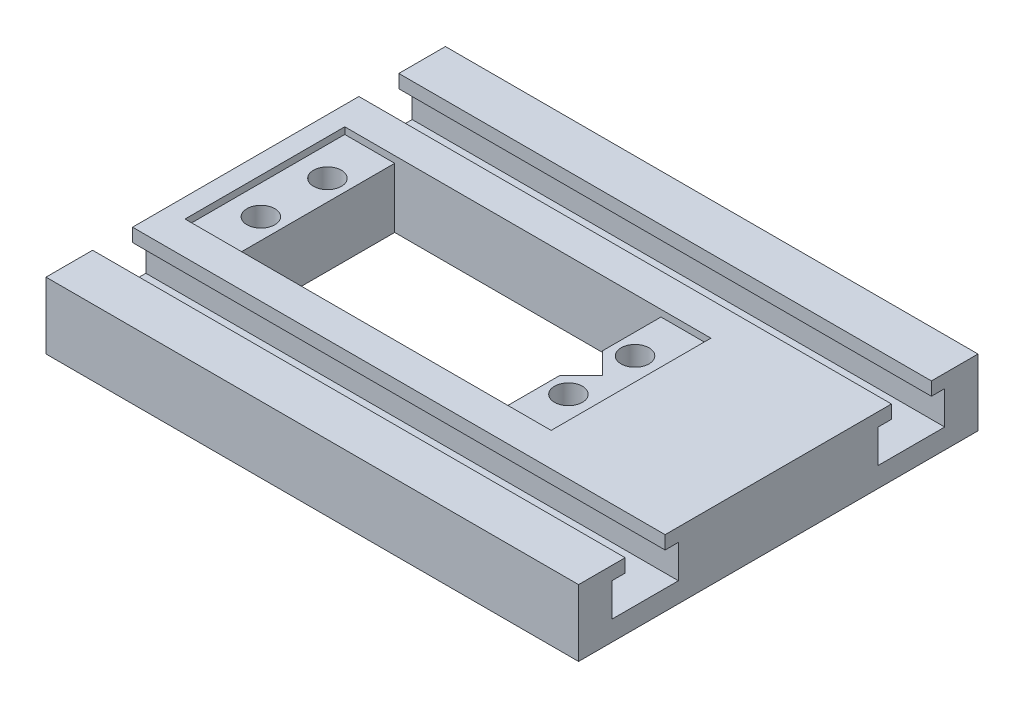
ISO-10303-21;
HEADER;
FILE_DESCRIPTION(('STEP AP214'),'2;1');
FILE_NAME('part.step','',(''),(''),'','','');
FILE_SCHEMA(('AUTOMOTIVE_DESIGN { 1 0 10303 214 1 1 1 1 }'));
ENDSEC;
DATA;
#1=APPLICATION_CONTEXT('core data for automotive mechanical design processes');
#2=APPLICATION_PROTOCOL_DEFINITION('international standard','automotive_design',2000,#1);
#3=PRODUCT_CONTEXT('',#1,'mechanical');
#4=PRODUCT('Part','Part','',(#3));
#5=PRODUCT_RELATED_PRODUCT_CATEGORY('part','',(#4));
#6=PRODUCT_DEFINITION_FORMATION('','',#4);
#7=PRODUCT_DEFINITION_CONTEXT('part definition',#1,'design');
#8=PRODUCT_DEFINITION('design','',#6,#7);
#9=PRODUCT_DEFINITION_SHAPE('','',#8);
#10=(LENGTH_UNIT() NAMED_UNIT(*) SI_UNIT(.MILLI.,.METRE.));
#11=(NAMED_UNIT(*) PLANE_ANGLE_UNIT() SI_UNIT($,.RADIAN.));
#12=(NAMED_UNIT(*) SI_UNIT($,.STERADIAN.) SOLID_ANGLE_UNIT());
#13=UNCERTAINTY_MEASURE_WITH_UNIT(LENGTH_MEASURE(1.E-05),#10,'distance_accuracy_value','');
#14=(GEOMETRIC_REPRESENTATION_CONTEXT(3) GLOBAL_UNCERTAINTY_ASSIGNED_CONTEXT((#13)) GLOBAL_UNIT_ASSIGNED_CONTEXT((#10,
#11,#12)) REPRESENTATION_CONTEXT('',''));
#15=CARTESIAN_POINT('',(0.,0.,0.));
#16=DIRECTION('',(0.,0.,1.));
#17=DIRECTION('',(1.,0.,0.));
#18=AXIS2_PLACEMENT_3D('',#15,#16,#17);
#19=CARTESIAN_POINT('',(10.38,10.,0.));
#20=DIRECTION('',(1.,0.,0.));
#21=DIRECTION('',(0.,0.,-1.));
#22=AXIS2_PLACEMENT_3D('',#19,#20,#21);
#23=PLANE('',#22);
#24=DIRECTION('',(0.,0.,1.));
#25=VECTOR('',#24,1.);
#26=CARTESIAN_POINT('',(10.38,9.,0.));
#27=LINE('',#26,#25);
#28=CARTESIAN_POINT('',(10.38,9.,-12.));
#29=VERTEX_POINT('',#28);
#30=CARTESIAN_POINT('',(10.38,9.00000000000001,-3.25000000000005));
#31=VERTEX_POINT('',#30);
#32=EDGE_CURVE('E299',#29,#31,#27,.T.);
#33=ORIENTED_EDGE('',*,*,#32,.F.);
#34=DIRECTION('',(0.,-1.,0.));
#35=VECTOR('',#34,1.);
#36=CARTESIAN_POINT('',(10.38,10.,-12.));
#37=LINE('',#36,#35);
#38=CARTESIAN_POINT('',(10.38,0.,-12.));
#39=VERTEX_POINT('',#38);
#40=EDGE_CURVE('E578',#29,#39,#37,.T.);
#41=ORIENTED_EDGE('',*,*,#40,.T.);
#42=DIRECTION('',(0.,0.,1.));
#43=VECTOR('',#42,1.);
#44=CARTESIAN_POINT('',(10.38,0.,0.));
#45=LINE('',#44,#43);
#46=CARTESIAN_POINT('',(10.38,0.,-3.25000000000005));
#47=VERTEX_POINT('',#46);
#48=EDGE_CURVE('E557',#39,#47,#45,.T.);
#49=ORIENTED_EDGE('',*,*,#48,.T.);
#50=DIRECTION('',(0.,1.,0.));
#51=VECTOR('',#50,1.);
#52=CARTESIAN_POINT('',(10.38,-70.,-3.25000000000005));
#53=LINE('',#52,#51);
#54=EDGE_CURVE('E322',#47,#31,#53,.T.);
#55=ORIENTED_EDGE('',*,*,#54,.T.);
#56=EDGE_LOOP('',(#33,#41,#49,#55));
#57=FACE_BOUND('',#56,.T.);
#58=ADVANCED_FACE('F41',(#57),#23,.F.);
#59=CARTESIAN_POINT('',(0.,10.,0.));
#60=DIRECTION('',(0.,1.,0.));
#61=DIRECTION('',(0.,0.,1.));
#62=AXIS2_PLACEMENT_3D('',#59,#60,#61);
#63=PLANE('',#62);
#64=DIRECTION('',(1.,0.,0.));
#65=VECTOR('',#64,1.);
#66=CARTESIAN_POINT('',(-40.,10.,17.));
#67=LINE('',#66,#65);
#68=CARTESIAN_POINT('',(-40.,10.,17.));
#69=VERTEX_POINT('',#68);
#70=CARTESIAN_POINT('',(40.,10.,17.));
#71=VERTEX_POINT('',#70);
#72=EDGE_CURVE('E391',#69,#71,#67,.T.);
#73=ORIENTED_EDGE('',*,*,#72,.T.);
#74=DIRECTION('',(0.,0.,1.));
#75=VECTOR('',#74,1.);
#76=CARTESIAN_POINT('',(40.,10.,0.));
#77=LINE('',#76,#75);
#78=CARTESIAN_POINT('',(40.,10.,-17.));
#79=VERTEX_POINT('',#78);
#80=EDGE_CURVE('E499',#79,#71,#77,.T.);
#81=ORIENTED_EDGE('',*,*,#80,.F.);
#82=DIRECTION('',(1.,0.,0.));
#83=VECTOR('',#82,1.);
#84=CARTESIAN_POINT('',(-40.,10.,-17.));
#85=LINE('',#84,#83);
#86=CARTESIAN_POINT('',(-40.,10.,-17.));
#87=VERTEX_POINT('',#86);
#88=EDGE_CURVE('E445',#87,#79,#85,.T.);
#89=ORIENTED_EDGE('',*,*,#88,.F.);
#90=DIRECTION('',(0.,0.,1.));
#91=VECTOR('',#90,1.);
#92=CARTESIAN_POINT('',(-40.,10.,0.));
#93=LINE('',#92,#91);
#94=EDGE_CURVE('E510',#87,#69,#93,.T.);
#95=ORIENTED_EDGE('',*,*,#94,.T.);
#96=EDGE_LOOP('',(#73,#81,#89,#95));
#97=FACE_BOUND('',#96,.T.);
#98=DIRECTION('',(0.,0.,1.));
#99=VECTOR('',#98,1.);
#100=CARTESIAN_POINT('',(-37.12,10.,-12.));
#101=LINE('',#100,#99);
#102=CARTESIAN_POINT('',(-37.12,10.,-12.));
#103=VERTEX_POINT('',#102);
#104=CARTESIAN_POINT('',(-37.12,10.,12.));
#105=VERTEX_POINT('',#104);
#106=EDGE_CURVE('E251',#103,#105,#101,.T.);
#107=ORIENTED_EDGE('',*,*,#106,.F.);
#108=DIRECTION('',(1.,0.,0.));
#109=VECTOR('',#108,1.);
#110=CARTESIAN_POINT('',(0.,10.,-12.));
#111=LINE('',#110,#109);
#112=CARTESIAN_POINT('',(17.88,10.,-12.));
#113=VERTEX_POINT('',#112);
#114=EDGE_CURVE('E514',#103,#113,#111,.T.);
#115=ORIENTED_EDGE('',*,*,#114,.T.);
#116=DIRECTION('',(0.,0.,1.));
#117=VECTOR('',#116,1.);
#118=CARTESIAN_POINT('',(17.88,10.,-12.));
#119=LINE('',#118,#117);
#120=CARTESIAN_POINT('',(17.88,10.,12.));
#121=VERTEX_POINT('',#120);
#122=EDGE_CURVE('E269',#113,#121,#119,.T.);
#123=ORIENTED_EDGE('',*,*,#122,.T.);
#124=DIRECTION('',(1.,0.,0.));
#125=VECTOR('',#124,1.);
#126=CARTESIAN_POINT('',(0.,10.,12.));
#127=LINE('',#126,#125);
#128=EDGE_CURVE('E517',#105,#121,#127,.T.);
#129=ORIENTED_EDGE('',*,*,#128,.F.);
#130=EDGE_LOOP('',(#107,#115,#123,#129));
#131=FACE_BOUND('',#130,.T.);
#132=ADVANCED_FACE('F630',(#97,#131),#63,.T.);
#133=DIRECTION('',(0.,0.,1.));
#134=VECTOR('',#133,1.);
#135=CARTESIAN_POINT('',(10.38,9.,0.));
#136=LINE('',#135,#134);
#137=CARTESIAN_POINT('',(10.38,9.00000000000001,3.24999999999995));
#138=VERTEX_POINT('',#137);
#139=CARTESIAN_POINT('',(10.38,9.,12.));
#140=VERTEX_POINT('',#139);
#141=EDGE_CURVE('E296',#138,#140,#136,.T.);
#142=ORIENTED_EDGE('',*,*,#141,.F.);
#143=DIRECTION('',(0.,1.,0.));
#144=VECTOR('',#143,1.);
#145=CARTESIAN_POINT('',(10.38,-70.,3.24999999999995));
#146=LINE('',#145,#144);
#147=CARTESIAN_POINT('',(10.38,0.,3.24999999999995));
#148=VERTEX_POINT('',#147);
#149=EDGE_CURVE('E321',#148,#138,#146,.T.);
#150=ORIENTED_EDGE('',*,*,#149,.F.);
#151=CARTESIAN_POINT('',(10.38,0.,12.));
#152=VERTEX_POINT('',#151);
#153=EDGE_CURVE('E556',#148,#152,#45,.T.);
#154=ORIENTED_EDGE('',*,*,#153,.T.);
#155=DIRECTION('',(0.,-1.,0.));
#156=VECTOR('',#155,1.);
#157=CARTESIAN_POINT('',(10.38,10.,12.));
#158=LINE('',#157,#156);
#159=EDGE_CURVE('E575',#140,#152,#158,.T.);
#160=ORIENTED_EDGE('',*,*,#159,.F.);
#161=EDGE_LOOP('',(#142,#150,#154,#160));
#162=FACE_BOUND('',#161,.T.);
#163=ADVANCED_FACE('F722',(#162),#23,.F.);
#164=CARTESIAN_POINT('',(13.48,10.,-5.));
#165=DIRECTION('',(0.,-1.,0.));
#166=DIRECTION('',(0.,0.,-1.));
#167=AXIS2_PLACEMENT_3D('',#164,#165,#166);
#168=CYLINDRICAL_SURFACE('',#167,2.1);
#169=CARTESIAN_POINT('',(13.48,0.,-5.));
#170=DIRECTION('',(0.,1.,0.));
#171=DIRECTION('',(0.,0.,1.));
#172=AXIS2_PLACEMENT_3D('',#169,#170,#171);
#173=CIRCLE('',#172,2.1);
#174=CARTESIAN_POINT('',(13.48,0.,-2.9));
#175=VERTEX_POINT('',#174);
#176=EDGE_CURVE('E532',#175,#175,#173,.T.);
#177=ORIENTED_EDGE('',*,*,#176,.F.);
#178=EDGE_LOOP('',(#177));
#179=FACE_BOUND('',#178,.T.);
#180=CARTESIAN_POINT('',(13.48,9.,-5.));
#181=DIRECTION('',(0.,1.,0.));
#182=DIRECTION('',(0.,0.,1.));
#183=AXIS2_PLACEMENT_3D('',#180,#181,#182);
#184=CIRCLE('',#183,2.1);
#185=CARTESIAN_POINT('',(13.48,9.,-2.9));
#186=VERTEX_POINT('',#185);
#187=EDGE_CURVE('E317',#186,#186,#184,.T.);
#188=ORIENTED_EDGE('',*,*,#187,.T.);
#189=EDGE_LOOP('',(#188));
#190=FACE_BOUND('',#189,.T.);
#191=ADVANCED_FACE('F730',(#179,#190),#168,.F.);
#192=CARTESIAN_POINT('',(13.48,10.,5.));
#193=DIRECTION('',(0.,-1.,0.));
#194=DIRECTION('',(0.,0.,-1.));
#195=AXIS2_PLACEMENT_3D('',#192,#193,#194);
#196=CYLINDRICAL_SURFACE('',#195,2.1);
#197=CARTESIAN_POINT('',(13.48,0.,5.));
#198=DIRECTION('',(0.,1.,0.));
#199=DIRECTION('',(0.,0.,1.));
#200=AXIS2_PLACEMENT_3D('',#197,#198,#199);
#201=CIRCLE('',#200,2.1);
#202=CARTESIAN_POINT('',(13.48,0.,7.1));
#203=VERTEX_POINT('',#202);
#204=EDGE_CURVE('E528',#203,#203,#201,.T.);
#205=ORIENTED_EDGE('',*,*,#204,.F.);
#206=EDGE_LOOP('',(#205));
#207=FACE_BOUND('',#206,.T.);
#208=CARTESIAN_POINT('',(13.48,9.,5.));
#209=DIRECTION('',(0.,1.,0.));
#210=DIRECTION('',(0.,0.,1.));
#211=AXIS2_PLACEMENT_3D('',#208,#209,#210);
#212=CIRCLE('',#211,2.1);
#213=CARTESIAN_POINT('',(13.48,9.,7.1));
#214=VERTEX_POINT('',#213);
#215=EDGE_CURVE('E313',#214,#214,#212,.T.);
#216=ORIENTED_EDGE('',*,*,#215,.T.);
#217=EDGE_LOOP('',(#216));
#218=FACE_BOUND('',#217,.T.);
#219=ADVANCED_FACE('F734',(#207,#218),#196,.F.);
#220=CARTESIAN_POINT('',(-32.72,10.,-5.));
#221=DIRECTION('',(0.,-1.,0.));
#222=DIRECTION('',(0.,0.,-1.));
#223=AXIS2_PLACEMENT_3D('',#220,#221,#222);
#224=CYLINDRICAL_SURFACE('',#223,2.1);
#225=CARTESIAN_POINT('',(-32.72,0.,-5.));
#226=DIRECTION('',(0.,1.,0.));
#227=DIRECTION('',(0.,0.,1.));
#228=AXIS2_PLACEMENT_3D('',#225,#226,#227);
#229=CIRCLE('',#228,2.1);
#230=CARTESIAN_POINT('',(-32.72,0.,-2.9));
#231=VERTEX_POINT('',#230);
#232=EDGE_CURVE('E524',#231,#231,#229,.T.);
#233=ORIENTED_EDGE('',*,*,#232,.F.);
#234=EDGE_LOOP('',(#233));
#235=FACE_BOUND('',#234,.T.);
#236=CARTESIAN_POINT('',(-32.72,9.,-5.));
#237=DIRECTION('',(0.,1.,0.));
#238=DIRECTION('',(0.,0.,1.));
#239=AXIS2_PLACEMENT_3D('',#236,#237,#238);
#240=CIRCLE('',#239,2.1);
#241=CARTESIAN_POINT('',(-32.72,9.,-2.9));
#242=VERTEX_POINT('',#241);
#243=EDGE_CURVE('E309',#242,#242,#240,.T.);
#244=ORIENTED_EDGE('',*,*,#243,.T.);
#245=EDGE_LOOP('',(#244));
#246=FACE_BOUND('',#245,.T.);
#247=ADVANCED_FACE('F777',(#235,#246),#224,.F.);
#248=CARTESIAN_POINT('',(-32.72,10.,5.));
#249=DIRECTION('',(0.,-1.,0.));
#250=DIRECTION('',(0.,0.,-1.));
#251=AXIS2_PLACEMENT_3D('',#248,#249,#250);
#252=CYLINDRICAL_SURFACE('',#251,2.1);
#253=CARTESIAN_POINT('',(-32.72,0.,5.));
#254=DIRECTION('',(0.,1.,0.));
#255=DIRECTION('',(0.,0.,1.));
#256=AXIS2_PLACEMENT_3D('',#253,#254,#255);
#257=CIRCLE('',#256,2.1);
#258=CARTESIAN_POINT('',(-32.72,0.,7.1));
#259=VERTEX_POINT('',#258);
#260=EDGE_CURVE('E395',#259,#259,#257,.T.);
#261=ORIENTED_EDGE('',*,*,#260,.F.);
#262=EDGE_LOOP('',(#261));
#263=FACE_BOUND('',#262,.T.);
#264=CARTESIAN_POINT('',(-32.72,9.,5.));
#265=DIRECTION('',(0.,1.,0.));
#266=DIRECTION('',(0.,0.,1.));
#267=AXIS2_PLACEMENT_3D('',#264,#265,#266);
#268=CIRCLE('',#267,2.1);
#269=CARTESIAN_POINT('',(-32.72,9.,7.1));
#270=VERTEX_POINT('',#269);
#271=EDGE_CURVE('E305',#270,#270,#268,.T.);
#272=ORIENTED_EDGE('',*,*,#271,.T.);
#273=EDGE_LOOP('',(#272));
#274=FACE_BOUND('',#273,.T.);
#275=ADVANCED_FACE('F43',(#263,#274),#252,.F.);
#276=CARTESIAN_POINT('',(-29.62,10.,0.));
#277=DIRECTION('',(1.,0.,0.));
#278=DIRECTION('',(0.,0.,-1.));
#279=AXIS2_PLACEMENT_3D('',#276,#277,#278);
#280=PLANE('',#279);
#281=DIRECTION('',(0.,-1.,0.));
#282=VECTOR('',#281,1.);
#283=CARTESIAN_POINT('',(-29.62,10.,-12.));
#284=LINE('',#283,#282);
#285=CARTESIAN_POINT('',(-29.62,9.,-12.));
#286=VERTEX_POINT('',#285);
#287=CARTESIAN_POINT('',(-29.62,0.,-12.));
#288=VERTEX_POINT('',#287);
#289=EDGE_CURVE('E569',#286,#288,#284,.T.);
#290=ORIENTED_EDGE('',*,*,#289,.F.);
#291=DIRECTION('',(0.,0.,1.));
#292=VECTOR('',#291,1.);
#293=CARTESIAN_POINT('',(-29.62,9.,0.));
#294=LINE('',#293,#292);
#295=CARTESIAN_POINT('',(-29.62,9.,12.));
#296=VERTEX_POINT('',#295);
#297=EDGE_CURVE('E302',#286,#296,#294,.T.);
#298=ORIENTED_EDGE('',*,*,#297,.T.);
#299=DIRECTION('',(0.,-1.,0.));
#300=VECTOR('',#299,1.);
#301=CARTESIAN_POINT('',(-29.62,10.,12.));
#302=LINE('',#301,#300);
#303=CARTESIAN_POINT('',(-29.62,0.,12.));
#304=VERTEX_POINT('',#303);
#305=EDGE_CURVE('E260',#296,#304,#302,.T.);
#306=ORIENTED_EDGE('',*,*,#305,.T.);
#307=DIRECTION('',(0.,0.,1.));
#308=VECTOR('',#307,1.);
#309=CARTESIAN_POINT('',(-29.62,0.,0.));
#310=LINE('',#309,#308);
#311=EDGE_CURVE('E565',#288,#304,#310,.T.);
#312=ORIENTED_EDGE('',*,*,#311,.F.);
#313=EDGE_LOOP('',(#290,#298,#306,#312));
#314=FACE_BOUND('',#313,.T.);
#315=ADVANCED_FACE('F613',(#314),#280,.T.);
#316=CARTESIAN_POINT('',(10.38,-70.,-3.25000000000005));
#317=DIRECTION('',(0.707106781186551,0.,-0.707106781186544));
#318=DIRECTION('',(-0.707106781186544,0.,-0.707106781186551));
#319=AXIS2_PLACEMENT_3D('',#316,#317,#318);
#320=PLANE('',#319);
#321=DIRECTION('',(0.707106781186544,0.,0.707106781186551));
#322=VECTOR('',#321,1.);
#323=CARTESIAN_POINT('',(10.38,9.00000000000001,-3.25000000000005));
#324=LINE('',#323,#322);
#325=CARTESIAN_POINT('',(13.63,9.00000000000001,0.));
#326=VERTEX_POINT('',#325);
#327=EDGE_CURVE('E64',#31,#326,#324,.T.);
#328=ORIENTED_EDGE('',*,*,#327,.F.);
#329=ORIENTED_EDGE('',*,*,#54,.F.);
#330=DIRECTION('',(-0.707106781186544,0.,-0.707106781186551));
#331=VECTOR('',#330,1.);
#332=CARTESIAN_POINT('',(6.81500000000008,0.,-6.81500000000001));
#333=LINE('',#332,#331);
#334=CARTESIAN_POINT('',(13.63,0.,0.));
#335=VERTEX_POINT('',#334);
#336=EDGE_CURVE('E50',#335,#47,#333,.T.);
#337=ORIENTED_EDGE('',*,*,#336,.F.);
#338=DIRECTION('',(0.,1.,0.));
#339=VECTOR('',#338,1.);
#340=CARTESIAN_POINT('',(13.63,-70.,0.));
#341=LINE('',#340,#339);
#342=EDGE_CURVE('E327',#335,#326,#341,.T.);
#343=ORIENTED_EDGE('',*,*,#342,.T.);
#344=EDGE_LOOP('',(#328,#329,#337,#343));
#345=FACE_BOUND('',#344,.T.);
#346=ADVANCED_FACE('F740',(#345),#320,.F.);
#347=CARTESIAN_POINT('',(13.63,-70.,0.));
#348=DIRECTION('',(0.707106781186541,0.,0.707106781186554));
#349=DIRECTION('',(0.707106781186554,0.,-0.707106781186541));
#350=AXIS2_PLACEMENT_3D('',#347,#348,#349);
#351=PLANE('',#350);
#352=DIRECTION('',(-0.707106781186554,0.,0.707106781186541));
#353=VECTOR('',#352,1.);
#354=CARTESIAN_POINT('',(13.63,9.00000000000001,0.));
#355=LINE('',#354,#353);
#356=EDGE_CURVE('E11',#326,#138,#355,.T.);
#357=ORIENTED_EDGE('',*,*,#356,.F.);
#358=ORIENTED_EDGE('',*,*,#342,.F.);
#359=DIRECTION('',(0.707106781186554,0.,-0.707106781186541));
#360=VECTOR('',#359,1.);
#361=CARTESIAN_POINT('',(6.81499999999988,0.,6.81500000000001));
#362=LINE('',#361,#360);
#363=EDGE_CURVE('E581',#148,#335,#362,.T.);
#364=ORIENTED_EDGE('',*,*,#363,.F.);
#365=ORIENTED_EDGE('',*,*,#149,.T.);
#366=EDGE_LOOP('',(#357,#358,#364,#365));
#367=FACE_BOUND('',#366,.T.);
#368=ADVANCED_FACE('F739',(#367),#351,.F.);
#369=DIRECTION('',(1.,0.,0.));
#370=VECTOR('',#369,1.);
#371=CARTESIAN_POINT('',(-40.,10.,-23.));
#372=LINE('',#371,#370);
#373=CARTESIAN_POINT('',(-40.,10.,-23.));
#374=VERTEX_POINT('',#373);
#375=CARTESIAN_POINT('',(40.,10.,-23.));
#376=VERTEX_POINT('',#375);
#377=EDGE_CURVE('E369',#374,#376,#372,.T.);
#378=ORIENTED_EDGE('',*,*,#377,.T.);
#379=CARTESIAN_POINT('',(40.,10.,-30.));
#380=VERTEX_POINT('',#379);
#381=EDGE_CURVE('E494',#380,#376,#77,.T.);
#382=ORIENTED_EDGE('',*,*,#381,.F.);
#383=DIRECTION('',(1.,0.,0.));
#384=VECTOR('',#383,1.);
#385=CARTESIAN_POINT('',(0.,10.,-30.));
#386=LINE('',#385,#384);
#387=CARTESIAN_POINT('',(-40.,10.,-30.));
#388=VERTEX_POINT('',#387);
#389=EDGE_CURVE('E498',#388,#380,#386,.T.);
#390=ORIENTED_EDGE('',*,*,#389,.F.);
#391=EDGE_CURVE('E505',#388,#374,#93,.T.);
#392=ORIENTED_EDGE('',*,*,#391,.T.);
#393=EDGE_LOOP('',(#378,#382,#390,#392));
#394=FACE_BOUND('',#393,.T.);
#395=ADVANCED_FACE('F674',(#394),#63,.T.);
#396=CARTESIAN_POINT('',(0.,10.,-12.));
#397=DIRECTION('',(0.,0.,-1.));
#398=DIRECTION('',(-1.,0.,0.));
#399=AXIS2_PLACEMENT_3D('',#396,#397,#398);
#400=PLANE('',#399);
#401=ORIENTED_EDGE('',*,*,#114,.F.);
#402=DIRECTION('',(0.,1.,0.));
#403=VECTOR('',#402,1.);
#404=CARTESIAN_POINT('',(-37.12,9.,-12.));
#405=LINE('',#404,#403);
#406=CARTESIAN_POINT('',(-37.12,9.,-12.));
#407=VERTEX_POINT('',#406);
#408=EDGE_CURVE('E284',#407,#103,#405,.T.);
#409=ORIENTED_EDGE('',*,*,#408,.F.);
#410=DIRECTION('',(1.,0.,0.));
#411=VECTOR('',#410,1.);
#412=CARTESIAN_POINT('',(-37.12,9.,-12.));
#413=LINE('',#412,#411);
#414=EDGE_CURVE('E255',#407,#286,#413,.T.);
#415=ORIENTED_EDGE('',*,*,#414,.T.);
#416=ORIENTED_EDGE('',*,*,#289,.T.);
#417=DIRECTION('',(1.,0.,0.));
#418=VECTOR('',#417,1.);
#419=CARTESIAN_POINT('',(0.,0.,-12.));
#420=LINE('',#419,#418);
#421=EDGE_CURVE('E552',#288,#39,#420,.T.);
#422=ORIENTED_EDGE('',*,*,#421,.T.);
#423=ORIENTED_EDGE('',*,*,#40,.F.);
#424=CARTESIAN_POINT('',(17.88,9.,-12.));
#425=VERTEX_POINT('',#424);
#426=EDGE_CURVE('E279',#29,#425,#413,.T.);
#427=ORIENTED_EDGE('',*,*,#426,.T.);
#428=DIRECTION('',(0.,1.,0.));
#429=VECTOR('',#428,1.);
#430=CARTESIAN_POINT('',(17.88,9.,-12.));
#431=LINE('',#430,#429);
#432=EDGE_CURVE('E287',#425,#113,#431,.T.);
#433=ORIENTED_EDGE('',*,*,#432,.T.);
#434=EDGE_LOOP('',(#401,#409,#415,#416,#422,#423,#427,#433));
#435=FACE_BOUND('',#434,.T.);
#436=ADVANCED_FACE('F608',(#435),#400,.F.);
#437=CARTESIAN_POINT('',(0.,10.,12.));
#438=DIRECTION('',(0.,0.,-1.));
#439=DIRECTION('',(-1.,0.,0.));
#440=AXIS2_PLACEMENT_3D('',#437,#438,#439);
#441=PLANE('',#440);
#442=ORIENTED_EDGE('',*,*,#128,.T.);
#443=DIRECTION('',(0.,1.,0.));
#444=VECTOR('',#443,1.);
#445=CARTESIAN_POINT('',(17.88,9.,12.));
#446=LINE('',#445,#444);
#447=CARTESIAN_POINT('',(17.88,9.,12.));
#448=VERTEX_POINT('',#447);
#449=EDGE_CURVE('E254',#448,#121,#446,.T.);
#450=ORIENTED_EDGE('',*,*,#449,.F.);
#451=DIRECTION('',(1.,0.,0.));
#452=VECTOR('',#451,1.);
#453=CARTESIAN_POINT('',(-37.12,9.,12.));
#454=LINE('',#453,#452);
#455=EDGE_CURVE('E263',#140,#448,#454,.T.);
#456=ORIENTED_EDGE('',*,*,#455,.F.);
#457=ORIENTED_EDGE('',*,*,#159,.T.);
#458=DIRECTION('',(1.,0.,0.));
#459=VECTOR('',#458,1.);
#460=CARTESIAN_POINT('',(0.,0.,12.));
#461=LINE('',#460,#459);
#462=EDGE_CURVE('E561',#304,#152,#461,.T.);
#463=ORIENTED_EDGE('',*,*,#462,.F.);
#464=ORIENTED_EDGE('',*,*,#305,.F.);
#465=CARTESIAN_POINT('',(-37.12,9.,12.));
#466=VERTEX_POINT('',#465);
#467=EDGE_CURVE('E57',#466,#296,#454,.T.);
#468=ORIENTED_EDGE('',*,*,#467,.F.);
#469=DIRECTION('',(0.,1.,0.));
#470=VECTOR('',#469,1.);
#471=CARTESIAN_POINT('',(-37.12,9.,12.));
#472=LINE('',#471,#470);
#473=EDGE_CURVE('E246',#466,#105,#472,.T.);
#474=ORIENTED_EDGE('',*,*,#473,.T.);
#475=EDGE_LOOP('',(#442,#450,#456,#457,#463,#464,#468,#474));
#476=FACE_BOUND('',#475,.T.);
#477=ADVANCED_FACE('F258',(#476),#441,.T.);
#478=CARTESIAN_POINT('',(40.,10.,0.));
#479=DIRECTION('',(1.,0.,0.));
#480=DIRECTION('',(0.,0.,-1.));
#481=AXIS2_PLACEMENT_3D('',#478,#479,#480);
#482=PLANE('',#481);
#483=DIRECTION('',(0.,1.,0.));
#484=VECTOR('',#483,1.);
#485=CARTESIAN_POINT('',(40.,8.,17.));
#486=LINE('',#485,#484);
#487=CARTESIAN_POINT('',(40.,8.,17.));
#488=VERTEX_POINT('',#487);
#489=EDGE_CURVE('E339',#488,#71,#486,.T.);
#490=ORIENTED_EDGE('',*,*,#489,.F.);
#491=DIRECTION('',(0.,0.,1.));
#492=VECTOR('',#491,1.);
#493=CARTESIAN_POINT('',(40.,8.,15.));
#494=LINE('',#493,#492);
#495=CARTESIAN_POINT('',(40.,8.,15.));
#496=VERTEX_POINT('',#495);
#497=EDGE_CURVE('E385',#496,#488,#494,.T.);
#498=ORIENTED_EDGE('',*,*,#497,.F.);
#499=DIRECTION('',(0.,1.,0.));
#500=VECTOR('',#499,1.);
#501=CARTESIAN_POINT('',(40.,3.,15.));
#502=LINE('',#501,#500);
#503=CARTESIAN_POINT('',(40.,3.,15.));
#504=VERTEX_POINT('',#503);
#505=EDGE_CURVE('E381',#504,#496,#502,.T.);
#506=ORIENTED_EDGE('',*,*,#505,.F.);
#507=DIRECTION('',(0.,0.,-1.));
#508=VECTOR('',#507,1.);
#509=CARTESIAN_POINT('',(40.,3.,25.));
#510=LINE('',#509,#508);
#511=CARTESIAN_POINT('',(40.,3.,25.));
#512=VERTEX_POINT('',#511);
#513=EDGE_CURVE('E377',#512,#504,#510,.T.);
#514=ORIENTED_EDGE('',*,*,#513,.F.);
#515=DIRECTION('',(0.,-1.,0.));
#516=VECTOR('',#515,1.);
#517=CARTESIAN_POINT('',(40.,8.,25.));
#518=LINE('',#517,#516);
#519=CARTESIAN_POINT('',(40.,8.,25.));
#520=VERTEX_POINT('',#519);
#521=EDGE_CURVE('E373',#520,#512,#518,.T.);
#522=ORIENTED_EDGE('',*,*,#521,.F.);
#523=DIRECTION('',(0.,0.,1.));
#524=VECTOR('',#523,1.);
#525=CARTESIAN_POINT('',(40.,8.,23.));
#526=LINE('',#525,#524);
#527=CARTESIAN_POINT('',(40.,8.,23.));
#528=VERTEX_POINT('',#527);
#529=EDGE_CURVE('E368',#528,#520,#526,.T.);
#530=ORIENTED_EDGE('',*,*,#529,.F.);
#531=DIRECTION('',(0.,-1.,0.));
#532=VECTOR('',#531,1.);
#533=CARTESIAN_POINT('',(40.,10.,23.));
#534=LINE('',#533,#532);
#535=CARTESIAN_POINT('',(40.,10.,23.));
#536=VERTEX_POINT('',#535);
#537=EDGE_CURVE('E364',#536,#528,#534,.T.);
#538=ORIENTED_EDGE('',*,*,#537,.F.);
#539=CARTESIAN_POINT('',(40.,10.,30.));
#540=VERTEX_POINT('',#539);
#541=EDGE_CURVE('E500',#536,#540,#77,.T.);
#542=ORIENTED_EDGE('',*,*,#541,.T.);
#543=DIRECTION('',(0.,-1.,0.));
#544=VECTOR('',#543,1.);
#545=CARTESIAN_POINT('',(40.,10.,30.));
#546=LINE('',#545,#544);
#547=CARTESIAN_POINT('',(40.,0.,30.));
#548=VERTEX_POINT('',#547);
#549=EDGE_CURVE('E520',#540,#548,#546,.T.);
#550=ORIENTED_EDGE('',*,*,#549,.T.);
#551=DIRECTION('',(0.,0.,1.));
#552=VECTOR('',#551,1.);
#553=CARTESIAN_POINT('',(40.,0.,0.));
#554=LINE('',#553,#552);
#555=CARTESIAN_POINT('',(40.,0.,-30.));
#556=VERTEX_POINT('',#555);
#557=EDGE_CURVE('E536',#556,#548,#554,.T.);
#558=ORIENTED_EDGE('',*,*,#557,.F.);
#559=DIRECTION('',(0.,-1.,0.));
#560=VECTOR('',#559,1.);
#561=CARTESIAN_POINT('',(40.,10.,-30.));
#562=LINE('',#561,#560);
#563=EDGE_CURVE('E572',#380,#556,#562,.T.);
#564=ORIENTED_EDGE('',*,*,#563,.F.);
#565=ORIENTED_EDGE('',*,*,#381,.T.);
#566=DIRECTION('',(0.,1.,0.));
#567=VECTOR('',#566,1.);
#568=CARTESIAN_POINT('',(40.,8.,-23.));
#569=LINE('',#568,#567);
#570=CARTESIAN_POINT('',(40.,8.,-23.));
#571=VERTEX_POINT('',#570);
#572=EDGE_CURVE('E421',#571,#376,#569,.T.);
#573=ORIENTED_EDGE('',*,*,#572,.F.);
#574=DIRECTION('',(0.,0.,1.));
#575=VECTOR('',#574,1.);
#576=CARTESIAN_POINT('',(40.,8.,-25.));
#577=LINE('',#576,#575);
#578=CARTESIAN_POINT('',(40.,8.,-25.));
#579=VERTEX_POINT('',#578);
#580=EDGE_CURVE('E465',#579,#571,#577,.T.);
#581=ORIENTED_EDGE('',*,*,#580,.F.);
#582=DIRECTION('',(0.,1.,0.));
#583=VECTOR('',#582,1.);
#584=CARTESIAN_POINT('',(40.,3.,-25.));
#585=LINE('',#584,#583);
#586=CARTESIAN_POINT('',(40.,3.,-25.));
#587=VERTEX_POINT('',#586);
#588=EDGE_CURVE('E461',#587,#579,#585,.T.);
#589=ORIENTED_EDGE('',*,*,#588,.F.);
#590=DIRECTION('',(0.,0.,-1.));
#591=VECTOR('',#590,1.);
#592=CARTESIAN_POINT('',(40.,3.,-15.));
#593=LINE('',#592,#591);
#594=CARTESIAN_POINT('',(40.,3.,-15.));
#595=VERTEX_POINT('',#594);
#596=EDGE_CURVE('E457',#595,#587,#593,.T.);
#597=ORIENTED_EDGE('',*,*,#596,.F.);
#598=DIRECTION('',(0.,-1.,0.));
#599=VECTOR('',#598,1.);
#600=CARTESIAN_POINT('',(40.,8.,-15.));
#601=LINE('',#600,#599);
#602=CARTESIAN_POINT('',(40.,8.,-15.));
#603=VERTEX_POINT('',#602);
#604=EDGE_CURVE('E453',#603,#595,#601,.T.);
#605=ORIENTED_EDGE('',*,*,#604,.F.);
#606=DIRECTION('',(0.,0.,1.));
#607=VECTOR('',#606,1.);
#608=CARTESIAN_POINT('',(40.,8.,-17.));
#609=LINE('',#608,#607);
#610=CARTESIAN_POINT('',(40.,8.,-17.));
#611=VERTEX_POINT('',#610);
#612=EDGE_CURVE('E449',#611,#603,#609,.T.);
#613=ORIENTED_EDGE('',*,*,#612,.F.);
#614=DIRECTION('',(0.,-1.,0.));
#615=VECTOR('',#614,1.);
#616=CARTESIAN_POINT('',(40.,10.,-17.));
#617=LINE('',#616,#615);
#618=EDGE_CURVE('E326',#79,#611,#617,.T.);
#619=ORIENTED_EDGE('',*,*,#618,.F.);
#620=ORIENTED_EDGE('',*,*,#80,.T.);
#621=EDGE_LOOP('',(#490,#498,#506,#514,#522,#530,#538,#542,#550,#558,#564,#565,#573,#581,#589,
#597,#605,#613,#619,#620));
#622=FACE_BOUND('',#621,.T.);
#623=ADVANCED_FACE('F642',(#622),#482,.T.);
#624=CARTESIAN_POINT('',(0.,10.,-30.));
#625=DIRECTION('',(0.,0.,-1.));
#626=DIRECTION('',(-1.,0.,0.));
#627=AXIS2_PLACEMENT_3D('',#624,#625,#626);
#628=PLANE('',#627);
#629=DIRECTION('',(1.,0.,0.));
#630=VECTOR('',#629,1.);
#631=CARTESIAN_POINT('',(0.,0.,-30.));
#632=LINE('',#631,#630);
#633=CARTESIAN_POINT('',(-40.,0.,-30.));
#634=VERTEX_POINT('',#633);
#635=EDGE_CURVE('E540',#634,#556,#632,.T.);
#636=ORIENTED_EDGE('',*,*,#635,.F.);
#637=DIRECTION('',(0.,-1.,0.));
#638=VECTOR('',#637,1.);
#639=CARTESIAN_POINT('',(-40.,10.,-30.));
#640=LINE('',#639,#638);
#641=EDGE_CURVE('E588',#388,#634,#640,.T.);
#642=ORIENTED_EDGE('',*,*,#641,.F.);
#643=ORIENTED_EDGE('',*,*,#389,.T.);
#644=ORIENTED_EDGE('',*,*,#563,.T.);
#645=EDGE_LOOP('',(#636,#642,#643,#644));
#646=FACE_BOUND('',#645,.T.);
#647=ADVANCED_FACE('F679',(#646),#628,.T.);
#648=CARTESIAN_POINT('',(-40.,10.,0.));
#649=DIRECTION('',(1.,0.,0.));
#650=DIRECTION('',(0.,0.,-1.));
#651=AXIS2_PLACEMENT_3D('',#648,#649,#650);
#652=PLANE('',#651);
#653=DIRECTION('',(0.,0.,1.));
#654=VECTOR('',#653,1.);
#655=CARTESIAN_POINT('',(-40.,8.,15.));
#656=LINE('',#655,#654);
#657=CARTESIAN_POINT('',(-40.,8.,15.));
#658=VERTEX_POINT('',#657);
#659=CARTESIAN_POINT('',(-40.,8.,17.));
#660=VERTEX_POINT('',#659);
#661=EDGE_CURVE('E355',#658,#660,#656,.T.);
#662=ORIENTED_EDGE('',*,*,#661,.T.);
#663=DIRECTION('',(0.,1.,0.));
#664=VECTOR('',#663,1.);
#665=CARTESIAN_POINT('',(-40.,8.,17.));
#666=LINE('',#665,#664);
#667=EDGE_CURVE('E359',#660,#69,#666,.T.);
#668=ORIENTED_EDGE('',*,*,#667,.T.);
#669=ORIENTED_EDGE('',*,*,#94,.F.);
#670=DIRECTION('',(0.,-1.,0.));
#671=VECTOR('',#670,1.);
#672=CARTESIAN_POINT('',(-40.,10.,-17.));
#673=LINE('',#672,#671);
#674=CARTESIAN_POINT('',(-40.,8.,-17.));
#675=VERTEX_POINT('',#674);
#676=EDGE_CURVE('E416',#87,#675,#673,.T.);
#677=ORIENTED_EDGE('',*,*,#676,.T.);
#678=DIRECTION('',(0.,0.,1.));
#679=VECTOR('',#678,1.);
#680=CARTESIAN_POINT('',(-40.,8.,-17.));
#681=LINE('',#680,#679);
#682=CARTESIAN_POINT('',(-40.,8.,-15.));
#683=VERTEX_POINT('',#682);
#684=EDGE_CURVE('E420',#675,#683,#681,.T.);
#685=ORIENTED_EDGE('',*,*,#684,.T.);
#686=DIRECTION('',(0.,-1.,0.));
#687=VECTOR('',#686,1.);
#688=CARTESIAN_POINT('',(-40.,8.,-15.));
#689=LINE('',#688,#687);
#690=CARTESIAN_POINT('',(-40.,3.,-15.));
#691=VERTEX_POINT('',#690);
#692=EDGE_CURVE('E425',#683,#691,#689,.T.);
#693=ORIENTED_EDGE('',*,*,#692,.T.);
#694=DIRECTION('',(0.,0.,-1.));
#695=VECTOR('',#694,1.);
#696=CARTESIAN_POINT('',(-40.,3.,-15.));
#697=LINE('',#696,#695);
#698=CARTESIAN_POINT('',(-40.,3.,-25.));
#699=VERTEX_POINT('',#698);
#700=EDGE_CURVE('E429',#691,#699,#697,.T.);
#701=ORIENTED_EDGE('',*,*,#700,.T.);
#702=DIRECTION('',(0.,1.,0.));
#703=VECTOR('',#702,1.);
#704=CARTESIAN_POINT('',(-40.,3.,-25.));
#705=LINE('',#704,#703);
#706=CARTESIAN_POINT('',(-40.,8.,-25.));
#707=VERTEX_POINT('',#706);
#708=EDGE_CURVE('E433',#699,#707,#705,.T.);
#709=ORIENTED_EDGE('',*,*,#708,.T.);
#710=DIRECTION('',(0.,0.,1.));
#711=VECTOR('',#710,1.);
#712=CARTESIAN_POINT('',(-40.,8.,-25.));
#713=LINE('',#712,#711);
#714=CARTESIAN_POINT('',(-40.,8.,-23.));
#715=VERTEX_POINT('',#714);
#716=EDGE_CURVE('E437',#707,#715,#713,.T.);
#717=ORIENTED_EDGE('',*,*,#716,.T.);
#718=DIRECTION('',(0.,1.,0.));
#719=VECTOR('',#718,1.);
#720=CARTESIAN_POINT('',(-40.,8.,-23.));
#721=LINE('',#720,#719);
#722=EDGE_CURVE('E441',#715,#374,#721,.T.);
#723=ORIENTED_EDGE('',*,*,#722,.T.);
#724=ORIENTED_EDGE('',*,*,#391,.F.);
#725=ORIENTED_EDGE('',*,*,#641,.T.);
#726=DIRECTION('',(0.,0.,1.));
#727=VECTOR('',#726,1.);
#728=CARTESIAN_POINT('',(-40.,0.,0.));
#729=LINE('',#728,#727);
#730=CARTESIAN_POINT('',(-40.,0.,30.));
#731=VERTEX_POINT('',#730);
#732=EDGE_CURVE('E544',#634,#731,#729,.T.);
#733=ORIENTED_EDGE('',*,*,#732,.T.);
#734=DIRECTION('',(0.,-1.,0.));
#735=VECTOR('',#734,1.);
#736=CARTESIAN_POINT('',(-40.,10.,30.));
#737=LINE('',#736,#735);
#738=CARTESIAN_POINT('',(-40.,10.,30.));
#739=VERTEX_POINT('',#738);
#740=EDGE_CURVE('E584',#739,#731,#737,.T.);
#741=ORIENTED_EDGE('',*,*,#740,.F.);
#742=CARTESIAN_POINT('',(-40.,10.,23.));
#743=VERTEX_POINT('',#742);
#744=EDGE_CURVE('E504',#743,#739,#93,.T.);
#745=ORIENTED_EDGE('',*,*,#744,.F.);
#746=DIRECTION('',(0.,-1.,0.));
#747=VECTOR('',#746,1.);
#748=CARTESIAN_POINT('',(-40.,10.,23.));
#749=LINE('',#748,#747);
#750=CARTESIAN_POINT('',(-40.,8.,23.));
#751=VERTEX_POINT('',#750);
#752=EDGE_CURVE('E334',#743,#751,#749,.T.);
#753=ORIENTED_EDGE('',*,*,#752,.T.);
#754=DIRECTION('',(0.,0.,1.));
#755=VECTOR('',#754,1.);
#756=CARTESIAN_POINT('',(-40.,8.,23.));
#757=LINE('',#756,#755);
#758=CARTESIAN_POINT('',(-40.,8.,25.));
#759=VERTEX_POINT('',#758);
#760=EDGE_CURVE('E338',#751,#759,#757,.T.);
#761=ORIENTED_EDGE('',*,*,#760,.T.);
#762=DIRECTION('',(0.,-1.,0.));
#763=VECTOR('',#762,1.);
#764=CARTESIAN_POINT('',(-40.,8.,25.));
#765=LINE('',#764,#763);
#766=CARTESIAN_POINT('',(-40.,3.,25.));
#767=VERTEX_POINT('',#766);
#768=EDGE_CURVE('E343',#759,#767,#765,.T.);
#769=ORIENTED_EDGE('',*,*,#768,.T.);
#770=DIRECTION('',(0.,0.,-1.));
#771=VECTOR('',#770,1.);
#772=CARTESIAN_POINT('',(-40.,3.,25.));
#773=LINE('',#772,#771);
#774=CARTESIAN_POINT('',(-40.,3.,15.));
#775=VERTEX_POINT('',#774);
#776=EDGE_CURVE('E347',#767,#775,#773,.T.);
#777=ORIENTED_EDGE('',*,*,#776,.T.);
#778=DIRECTION('',(0.,1.,0.));
#779=VECTOR('',#778,1.);
#780=CARTESIAN_POINT('',(-40.,3.,15.));
#781=LINE('',#780,#779);
#782=EDGE_CURVE('E351',#775,#658,#781,.T.);
#783=ORIENTED_EDGE('',*,*,#782,.T.);
#784=EDGE_LOOP('',(#662,#668,#669,#677,#685,#693,#701,#709,#717,#723,#724,#725,#733,#741,#745,
#753,#761,#769,#777,#783));
#785=FACE_BOUND('',#784,.T.);
#786=ADVANCED_FACE('F634',(#785),#652,.F.);
#787=CARTESIAN_POINT('',(0.,10.,30.));
#788=DIRECTION('',(0.,0.,-1.));
#789=DIRECTION('',(-1.,0.,0.));
#790=AXIS2_PLACEMENT_3D('',#787,#788,#789);
#791=PLANE('',#790);
#792=DIRECTION('',(1.,0.,0.));
#793=VECTOR('',#792,1.);
#794=CARTESIAN_POINT('',(0.,0.,30.));
#795=LINE('',#794,#793);
#796=EDGE_CURVE('E548',#731,#548,#795,.T.);
#797=ORIENTED_EDGE('',*,*,#796,.T.);
#798=ORIENTED_EDGE('',*,*,#549,.F.);
#799=DIRECTION('',(1.,0.,0.));
#800=VECTOR('',#799,1.);
#801=CARTESIAN_POINT('',(0.,10.,30.));
#802=LINE('',#801,#800);
#803=EDGE_CURVE('E509',#739,#540,#802,.T.);
#804=ORIENTED_EDGE('',*,*,#803,.F.);
#805=ORIENTED_EDGE('',*,*,#740,.T.);
#806=EDGE_LOOP('',(#797,#798,#804,#805));
#807=FACE_BOUND('',#806,.T.);
#808=ADVANCED_FACE('F686',(#807),#791,.F.);
#809=DIRECTION('',(1.,0.,0.));
#810=VECTOR('',#809,1.);
#811=CARTESIAN_POINT('',(-40.,10.,23.));
#812=LINE('',#811,#810);
#813=EDGE_CURVE('E363',#743,#536,#812,.T.);
#814=ORIENTED_EDGE('',*,*,#813,.F.);
#815=ORIENTED_EDGE('',*,*,#744,.T.);
#816=ORIENTED_EDGE('',*,*,#803,.T.);
#817=ORIENTED_EDGE('',*,*,#541,.F.);
#818=EDGE_LOOP('',(#814,#815,#816,#817));
#819=FACE_BOUND('',#818,.T.);
#820=ADVANCED_FACE('F690',(#819),#63,.T.);
#821=CARTESIAN_POINT('',(0.,0.,0.));
#822=DIRECTION('',(0.,1.,0.));
#823=DIRECTION('',(0.,0.,1.));
#824=AXIS2_PLACEMENT_3D('',#821,#822,#823);
#825=PLANE('',#824);
#826=ORIENTED_EDGE('',*,*,#260,.T.);
#827=EDGE_LOOP('',(#826));
#828=FACE_BOUND('',#827,.T.);
#829=ORIENTED_EDGE('',*,*,#232,.T.);
#830=EDGE_LOOP('',(#829));
#831=FACE_BOUND('',#830,.T.);
#832=ORIENTED_EDGE('',*,*,#204,.T.);
#833=EDGE_LOOP('',(#832));
#834=FACE_BOUND('',#833,.T.);
#835=ORIENTED_EDGE('',*,*,#176,.T.);
#836=EDGE_LOOP('',(#835));
#837=FACE_BOUND('',#836,.T.);
#838=ORIENTED_EDGE('',*,*,#557,.T.);
#839=ORIENTED_EDGE('',*,*,#796,.F.);
#840=ORIENTED_EDGE('',*,*,#732,.F.);
#841=ORIENTED_EDGE('',*,*,#635,.T.);
#842=EDGE_LOOP('',(#838,#839,#840,#841));
#843=FACE_BOUND('',#842,.T.);
#844=ORIENTED_EDGE('',*,*,#363,.T.);
#845=ORIENTED_EDGE('',*,*,#336,.T.);
#846=ORIENTED_EDGE('',*,*,#48,.F.);
#847=ORIENTED_EDGE('',*,*,#421,.F.);
#848=ORIENTED_EDGE('',*,*,#311,.T.);
#849=ORIENTED_EDGE('',*,*,#462,.T.);
#850=ORIENTED_EDGE('',*,*,#153,.F.);
#851=EDGE_LOOP('',(#844,#845,#846,#847,#848,#849,#850));
#852=FACE_BOUND('',#851,.T.);
#853=ADVANCED_FACE('F600',(#828,#831,#834,#837,#843,#852),#825,.F.);
#854=CARTESIAN_POINT('',(-40.,8.,-23.));
#855=DIRECTION('',(0.,0.,-1.));
#856=DIRECTION('',(-1.,0.,0.));
#857=AXIS2_PLACEMENT_3D('',#854,#855,#856);
#858=PLANE('',#857);
#859=ORIENTED_EDGE('',*,*,#572,.T.);
#860=ORIENTED_EDGE('',*,*,#377,.F.);
#861=ORIENTED_EDGE('',*,*,#722,.F.);
#862=DIRECTION('',(1.,0.,0.));
#863=VECTOR('',#862,1.);
#864=CARTESIAN_POINT('',(-40.,8.,-23.));
#865=LINE('',#864,#863);
#866=EDGE_CURVE('E474',#715,#571,#865,.T.);
#867=ORIENTED_EDGE('',*,*,#866,.T.);
#868=EDGE_LOOP('',(#859,#860,#861,#867));
#869=FACE_BOUND('',#868,.T.);
#870=ADVANCED_FACE('F671',(#869),#858,.F.);
#871=CARTESIAN_POINT('',(-40.,8.,-25.));
#872=DIRECTION('',(0.,1.,0.));
#873=DIRECTION('',(0.,0.,1.));
#874=AXIS2_PLACEMENT_3D('',#871,#872,#873);
#875=PLANE('',#874);
#876=ORIENTED_EDGE('',*,*,#580,.T.);
#877=ORIENTED_EDGE('',*,*,#866,.F.);
#878=ORIENTED_EDGE('',*,*,#716,.F.);
#879=DIRECTION('',(1.,0.,0.));
#880=VECTOR('',#879,1.);
#881=CARTESIAN_POINT('',(-40.,8.,-25.));
#882=LINE('',#881,#880);
#883=EDGE_CURVE('E477',#707,#579,#882,.T.);
#884=ORIENTED_EDGE('',*,*,#883,.T.);
#885=EDGE_LOOP('',(#876,#877,#878,#884));
#886=FACE_BOUND('',#885,.T.);
#887=ADVANCED_FACE('F667',(#886),#875,.F.);
#888=CARTESIAN_POINT('',(-40.,3.,-25.));
#889=DIRECTION('',(0.,0.,-1.));
#890=DIRECTION('',(-1.,0.,0.));
#891=AXIS2_PLACEMENT_3D('',#888,#889,#890);
#892=PLANE('',#891);
#893=ORIENTED_EDGE('',*,*,#588,.T.);
#894=ORIENTED_EDGE('',*,*,#883,.F.);
#895=ORIENTED_EDGE('',*,*,#708,.F.);
#896=DIRECTION('',(1.,0.,0.));
#897=VECTOR('',#896,1.);
#898=CARTESIAN_POINT('',(-40.,3.,-25.));
#899=LINE('',#898,#897);
#900=EDGE_CURVE('E480',#699,#587,#899,.T.);
#901=ORIENTED_EDGE('',*,*,#900,.T.);
#902=EDGE_LOOP('',(#893,#894,#895,#901));
#903=FACE_BOUND('',#902,.T.);
#904=ADVANCED_FACE('F662',(#903),#892,.F.);
#905=CARTESIAN_POINT('',(-40.,3.,-15.));
#906=DIRECTION('',(0.,-1.,0.));
#907=DIRECTION('',(0.,0.,-1.));
#908=AXIS2_PLACEMENT_3D('',#905,#906,#907);
#909=PLANE('',#908);
#910=ORIENTED_EDGE('',*,*,#596,.T.);
#911=ORIENTED_EDGE('',*,*,#900,.F.);
#912=ORIENTED_EDGE('',*,*,#700,.F.);
#913=DIRECTION('',(1.,0.,0.));
#914=VECTOR('',#913,1.);
#915=CARTESIAN_POINT('',(-40.,3.,-15.));
#916=LINE('',#915,#914);
#917=EDGE_CURVE('E483',#691,#595,#916,.T.);
#918=ORIENTED_EDGE('',*,*,#917,.T.);
#919=EDGE_LOOP('',(#910,#911,#912,#918));
#920=FACE_BOUND('',#919,.T.);
#921=ADVANCED_FACE('F658',(#920),#909,.F.);
#922=CARTESIAN_POINT('',(-40.,8.,-15.));
#923=DIRECTION('',(0.,0.,1.));
#924=DIRECTION('',(0.,-1.,0.));
#925=AXIS2_PLACEMENT_3D('',#922,#923,#924);
#926=PLANE('',#925);
#927=ORIENTED_EDGE('',*,*,#604,.T.);
#928=ORIENTED_EDGE('',*,*,#917,.F.);
#929=ORIENTED_EDGE('',*,*,#692,.F.);
#930=DIRECTION('',(1.,0.,0.));
#931=VECTOR('',#930,1.);
#932=CARTESIAN_POINT('',(-40.,8.,-15.));
#933=LINE('',#932,#931);
#934=EDGE_CURVE('E486',#683,#603,#933,.T.);
#935=ORIENTED_EDGE('',*,*,#934,.T.);
#936=EDGE_LOOP('',(#927,#928,#929,#935));
#937=FACE_BOUND('',#936,.T.);
#938=ADVANCED_FACE('F655',(#937),#926,.F.);
#939=CARTESIAN_POINT('',(-40.,8.,-17.));
#940=DIRECTION('',(0.,1.,0.));
#941=DIRECTION('',(0.,0.,1.));
#942=AXIS2_PLACEMENT_3D('',#939,#940,#941);
#943=PLANE('',#942);
#944=ORIENTED_EDGE('',*,*,#612,.T.);
#945=ORIENTED_EDGE('',*,*,#934,.F.);
#946=ORIENTED_EDGE('',*,*,#684,.F.);
#947=DIRECTION('',(1.,0.,0.));
#948=VECTOR('',#947,1.);
#949=CARTESIAN_POINT('',(-40.,8.,-17.));
#950=LINE('',#949,#948);
#951=EDGE_CURVE('E489',#675,#611,#950,.T.);
#952=ORIENTED_EDGE('',*,*,#951,.T.);
#953=EDGE_LOOP('',(#944,#945,#946,#952));
#954=FACE_BOUND('',#953,.T.);
#955=ADVANCED_FACE('F651',(#954),#943,.F.);
#956=CARTESIAN_POINT('',(-40.,10.,-17.));
#957=DIRECTION('',(0.,0.,1.));
#958=DIRECTION('',(1.,0.,0.));
#959=AXIS2_PLACEMENT_3D('',#956,#957,#958);
#960=PLANE('',#959);
#961=ORIENTED_EDGE('',*,*,#618,.T.);
#962=ORIENTED_EDGE('',*,*,#951,.F.);
#963=ORIENTED_EDGE('',*,*,#676,.F.);
#964=ORIENTED_EDGE('',*,*,#88,.T.);
#965=EDGE_LOOP('',(#961,#962,#963,#964));
#966=FACE_BOUND('',#965,.T.);
#967=ADVANCED_FACE('F648',(#966),#960,.F.);
#968=CARTESIAN_POINT('',(-40.,8.,17.));
#969=DIRECTION('',(0.,0.,-1.));
#970=DIRECTION('',(-1.,0.,0.));
#971=AXIS2_PLACEMENT_3D('',#968,#969,#970);
#972=PLANE('',#971);
#973=ORIENTED_EDGE('',*,*,#489,.T.);
#974=ORIENTED_EDGE('',*,*,#72,.F.);
#975=ORIENTED_EDGE('',*,*,#667,.F.);
#976=DIRECTION('',(1.,0.,0.));
#977=VECTOR('',#976,1.);
#978=CARTESIAN_POINT('',(-40.,8.,17.));
#979=LINE('',#978,#977);
#980=EDGE_CURVE('E396',#660,#488,#979,.T.);
#981=ORIENTED_EDGE('',*,*,#980,.T.);
#982=EDGE_LOOP('',(#973,#974,#975,#981));
#983=FACE_BOUND('',#982,.T.);
#984=ADVANCED_FACE('F638',(#983),#972,.F.);
#985=CARTESIAN_POINT('',(-40.,8.,15.));
#986=DIRECTION('',(0.,1.,0.));
#987=DIRECTION('',(0.,0.,1.));
#988=AXIS2_PLACEMENT_3D('',#985,#986,#987);
#989=PLANE('',#988);
#990=ORIENTED_EDGE('',*,*,#497,.T.);
#991=ORIENTED_EDGE('',*,*,#980,.F.);
#992=ORIENTED_EDGE('',*,*,#661,.F.);
#993=DIRECTION('',(1.,0.,0.));
#994=VECTOR('',#993,1.);
#995=CARTESIAN_POINT('',(-40.,8.,15.));
#996=LINE('',#995,#994);
#997=EDGE_CURVE('E399',#658,#496,#996,.T.);
#998=ORIENTED_EDGE('',*,*,#997,.T.);
#999=EDGE_LOOP('',(#990,#991,#992,#998));
#1000=FACE_BOUND('',#999,.T.);
#1001=ADVANCED_FACE('F711',(#1000),#989,.F.);
#1002=CARTESIAN_POINT('',(-40.,3.,15.));
#1003=DIRECTION('',(0.,0.,-1.));
#1004=DIRECTION('',(-1.,0.,0.));
#1005=AXIS2_PLACEMENT_3D('',#1002,#1003,#1004);
#1006=PLANE('',#1005);
#1007=ORIENTED_EDGE('',*,*,#505,.T.);
#1008=ORIENTED_EDGE('',*,*,#997,.F.);
#1009=ORIENTED_EDGE('',*,*,#782,.F.);
#1010=DIRECTION('',(1.,0.,0.));
#1011=VECTOR('',#1010,1.);
#1012=CARTESIAN_POINT('',(-40.,3.,15.));
#1013=LINE('',#1012,#1011);
#1014=EDGE_CURVE('E402',#775,#504,#1013,.T.);
#1015=ORIENTED_EDGE('',*,*,#1014,.T.);
#1016=EDGE_LOOP('',(#1007,#1008,#1009,#1015));
#1017=FACE_BOUND('',#1016,.T.);
#1018=ADVANCED_FACE('F709',(#1017),#1006,.F.);
#1019=CARTESIAN_POINT('',(-40.,3.,25.));
#1020=DIRECTION('',(0.,-1.,0.));
#1021=DIRECTION('',(0.,0.,-1.));
#1022=AXIS2_PLACEMENT_3D('',#1019,#1020,#1021);
#1023=PLANE('',#1022);
#1024=ORIENTED_EDGE('',*,*,#513,.T.);
#1025=ORIENTED_EDGE('',*,*,#1014,.F.);
#1026=ORIENTED_EDGE('',*,*,#776,.F.);
#1027=DIRECTION('',(1.,0.,0.));
#1028=VECTOR('',#1027,1.);
#1029=CARTESIAN_POINT('',(-40.,3.,25.));
#1030=LINE('',#1029,#1028);
#1031=EDGE_CURVE('E405',#767,#512,#1030,.T.);
#1032=ORIENTED_EDGE('',*,*,#1031,.T.);
#1033=EDGE_LOOP('',(#1024,#1025,#1026,#1032));
#1034=FACE_BOUND('',#1033,.T.);
#1035=ADVANCED_FACE('F706',(#1034),#1023,.F.);
#1036=CARTESIAN_POINT('',(-40.,8.,25.));
#1037=DIRECTION('',(0.,0.,1.));
#1038=DIRECTION('',(1.,0.,0.));
#1039=AXIS2_PLACEMENT_3D('',#1036,#1037,#1038);
#1040=PLANE('',#1039);
#1041=ORIENTED_EDGE('',*,*,#521,.T.);
#1042=ORIENTED_EDGE('',*,*,#1031,.F.);
#1043=ORIENTED_EDGE('',*,*,#768,.F.);
#1044=DIRECTION('',(1.,0.,0.));
#1045=VECTOR('',#1044,1.);
#1046=CARTESIAN_POINT('',(-40.,8.,25.));
#1047=LINE('',#1046,#1045);
#1048=EDGE_CURVE('E408',#759,#520,#1047,.T.);
#1049=ORIENTED_EDGE('',*,*,#1048,.T.);
#1050=EDGE_LOOP('',(#1041,#1042,#1043,#1049));
#1051=FACE_BOUND('',#1050,.T.);
#1052=ADVANCED_FACE('F704',(#1051),#1040,.F.);
#1053=CARTESIAN_POINT('',(-40.,8.,23.));
#1054=DIRECTION('',(0.,1.,0.));
#1055=DIRECTION('',(0.,0.,1.));
#1056=AXIS2_PLACEMENT_3D('',#1053,#1054,#1055);
#1057=PLANE('',#1056);
#1058=ORIENTED_EDGE('',*,*,#529,.T.);
#1059=ORIENTED_EDGE('',*,*,#1048,.F.);
#1060=ORIENTED_EDGE('',*,*,#760,.F.);
#1061=DIRECTION('',(1.,0.,0.));
#1062=VECTOR('',#1061,1.);
#1063=CARTESIAN_POINT('',(-40.,8.,23.));
#1064=LINE('',#1063,#1062);
#1065=EDGE_CURVE('E411',#751,#528,#1064,.T.);
#1066=ORIENTED_EDGE('',*,*,#1065,.T.);
#1067=EDGE_LOOP('',(#1058,#1059,#1060,#1066));
#1068=FACE_BOUND('',#1067,.T.);
#1069=ADVANCED_FACE('F699',(#1068),#1057,.F.);
#1070=CARTESIAN_POINT('',(-40.,10.,23.));
#1071=DIRECTION('',(0.,0.,1.));
#1072=DIRECTION('',(1.,0.,0.));
#1073=AXIS2_PLACEMENT_3D('',#1070,#1071,#1072);
#1074=PLANE('',#1073);
#1075=ORIENTED_EDGE('',*,*,#537,.T.);
#1076=ORIENTED_EDGE('',*,*,#1065,.F.);
#1077=ORIENTED_EDGE('',*,*,#752,.F.);
#1078=ORIENTED_EDGE('',*,*,#813,.T.);
#1079=EDGE_LOOP('',(#1075,#1076,#1077,#1078));
#1080=FACE_BOUND('',#1079,.T.);
#1081=ADVANCED_FACE('F694',(#1080),#1074,.F.);
#1082=CARTESIAN_POINT('',(0.,9.,0.));
#1083=DIRECTION('',(0.,1.,0.));
#1084=DIRECTION('',(0.,0.,1.));
#1085=AXIS2_PLACEMENT_3D('',#1082,#1083,#1084);
#1086=PLANE('',#1085);
#1087=ORIENTED_EDGE('',*,*,#187,.F.);
#1088=EDGE_LOOP('',(#1087));
#1089=FACE_BOUND('',#1088,.T.);
#1090=ORIENTED_EDGE('',*,*,#215,.F.);
#1091=EDGE_LOOP('',(#1090));
#1092=FACE_BOUND('',#1091,.T.);
#1093=ORIENTED_EDGE('',*,*,#32,.T.);
#1094=ORIENTED_EDGE('',*,*,#327,.T.);
#1095=ORIENTED_EDGE('',*,*,#356,.T.);
#1096=ORIENTED_EDGE('',*,*,#141,.T.);
#1097=ORIENTED_EDGE('',*,*,#455,.T.);
#1098=DIRECTION('',(0.,0.,1.));
#1099=VECTOR('',#1098,1.);
#1100=CARTESIAN_POINT('',(17.88,9.,-12.));
#1101=LINE('',#1100,#1099);
#1102=EDGE_CURVE('E262',#425,#448,#1101,.T.);
#1103=ORIENTED_EDGE('',*,*,#1102,.F.);
#1104=ORIENTED_EDGE('',*,*,#426,.F.);
#1105=EDGE_LOOP('',(#1093,#1094,#1095,#1096,#1097,#1103,#1104));
#1106=FACE_BOUND('',#1105,.T.);
#1107=ADVANCED_FACE('F755',(#1089,#1092,#1106),#1086,.T.);
#1108=CARTESIAN_POINT('',(17.88,9.,-12.));
#1109=DIRECTION('',(-1.,0.,0.));
#1110=DIRECTION('',(0.,0.,1.));
#1111=AXIS2_PLACEMENT_3D('',#1108,#1109,#1110);
#1112=PLANE('',#1111);
#1113=ORIENTED_EDGE('',*,*,#122,.F.);
#1114=ORIENTED_EDGE('',*,*,#432,.F.);
#1115=ORIENTED_EDGE('',*,*,#1102,.T.);
#1116=ORIENTED_EDGE('',*,*,#449,.T.);
#1117=EDGE_LOOP('',(#1113,#1114,#1115,#1116));
#1118=FACE_BOUND('',#1117,.T.);
#1119=ADVANCED_FACE('F752',(#1118),#1112,.T.);
#1120=CARTESIAN_POINT('',(-37.12,9.,-12.));
#1121=DIRECTION('',(-1.,0.,0.));
#1122=DIRECTION('',(0.,0.,1.));
#1123=AXIS2_PLACEMENT_3D('',#1120,#1121,#1122);
#1124=PLANE('',#1123);
#1125=ORIENTED_EDGE('',*,*,#106,.T.);
#1126=ORIENTED_EDGE('',*,*,#473,.F.);
#1127=DIRECTION('',(0.,0.,1.));
#1128=VECTOR('',#1127,1.);
#1129=CARTESIAN_POINT('',(-37.12,9.,-12.));
#1130=LINE('',#1129,#1128);
#1131=EDGE_CURVE('E249',#407,#466,#1130,.T.);
#1132=ORIENTED_EDGE('',*,*,#1131,.F.);
#1133=ORIENTED_EDGE('',*,*,#408,.T.);
#1134=EDGE_LOOP('',(#1125,#1126,#1132,#1133));
#1135=FACE_BOUND('',#1134,.T.);
#1136=ADVANCED_FACE('F247',(#1135),#1124,.F.);
#1137=ORIENTED_EDGE('',*,*,#243,.F.);
#1138=EDGE_LOOP('',(#1137));
#1139=FACE_BOUND('',#1138,.T.);
#1140=ORIENTED_EDGE('',*,*,#271,.F.);
#1141=EDGE_LOOP('',(#1140));
#1142=FACE_BOUND('',#1141,.T.);
#1143=ORIENTED_EDGE('',*,*,#414,.F.);
#1144=ORIENTED_EDGE('',*,*,#1131,.T.);
#1145=ORIENTED_EDGE('',*,*,#467,.T.);
#1146=ORIENTED_EDGE('',*,*,#297,.F.);
#1147=EDGE_LOOP('',(#1143,#1144,#1145,#1146));
#1148=FACE_BOUND('',#1147,.T.);
#1149=ADVANCED_FACE('F266',(#1139,#1142,#1148),#1086,.T.);
#1150=CLOSED_SHELL('',(#58,#132,#163,#191,#219,#247,#275,#315,#346,#368,#395,#436,#477,#623,
#647,#786,#808,#820,#853,#870,#887,#904,#921,#938,#955,#967,#984,#1001,#1018,#1035,#1052,#1069,
#1081,#1107,#1119,#1136,#1149));
#1151=MANIFOLD_SOLID_BREP('B2',#1150);
#1152=ADVANCED_BREP_SHAPE_REPRESENTATION('',(#18,#1151),#14);
#1153=SHAPE_DEFINITION_REPRESENTATION(#9,#1152);
ENDSEC;
END-ISO-10303-21;
